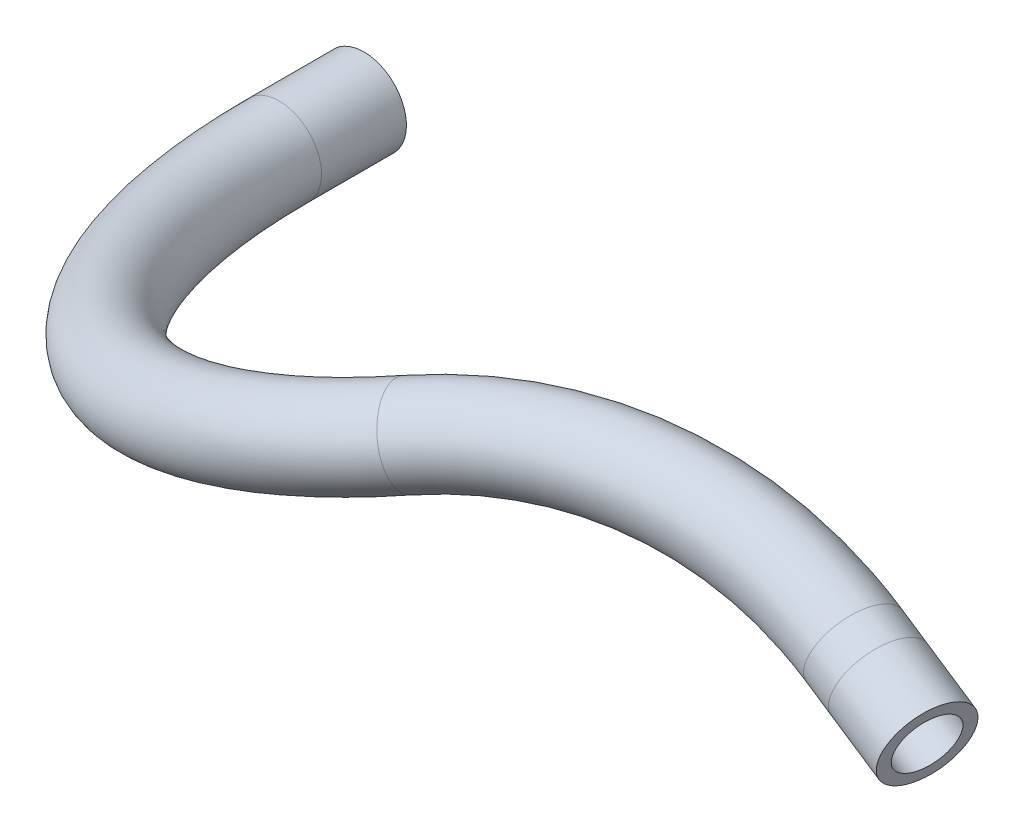
ISO-10303-21;
HEADER;
FILE_DESCRIPTION(('STEP AP214'),'2;1');
FILE_NAME('part.step','',(''),(''),'','','');
FILE_SCHEMA(('AUTOMOTIVE_DESIGN { 1 0 10303 214 1 1 1 1 }'));
ENDSEC;
DATA;
#1=APPLICATION_CONTEXT('core data for automotive mechanical design processes');
#2=APPLICATION_PROTOCOL_DEFINITION('international standard','automotive_design',2000,#1);
#3=PRODUCT_CONTEXT('',#1,'mechanical');
#4=PRODUCT('Part','Part','',(#3));
#5=PRODUCT_RELATED_PRODUCT_CATEGORY('part','',(#4));
#6=PRODUCT_DEFINITION_FORMATION('','',#4);
#7=PRODUCT_DEFINITION_CONTEXT('part definition',#1,'design');
#8=PRODUCT_DEFINITION('design','',#6,#7);
#9=PRODUCT_DEFINITION_SHAPE('','',#8);
#10=(LENGTH_UNIT() NAMED_UNIT(*) SI_UNIT(.MILLI.,.METRE.));
#11=(NAMED_UNIT(*) PLANE_ANGLE_UNIT() SI_UNIT($,.RADIAN.));
#12=(NAMED_UNIT(*) SI_UNIT($,.STERADIAN.) SOLID_ANGLE_UNIT());
#13=UNCERTAINTY_MEASURE_WITH_UNIT(LENGTH_MEASURE(1.E-05),#10,'distance_accuracy_value','');
#14=(GEOMETRIC_REPRESENTATION_CONTEXT(3) GLOBAL_UNCERTAINTY_ASSIGNED_CONTEXT((#13)) GLOBAL_UNIT_ASSIGNED_CONTEXT((#10,
#11,#12)) REPRESENTATION_CONTEXT('',''));
#15=CARTESIAN_POINT('',(0.,0.,0.));
#16=DIRECTION('',(0.,0.,1.));
#17=DIRECTION('',(1.,0.,0.));
#18=AXIS2_PLACEMENT_3D('',#15,#16,#17);
#19=CARTESIAN_POINT('',(23.4999999999999,73.,-26.9999999999999));
#20=DIRECTION('',(0.,0.,-1.));
#21=DIRECTION('',(0.414353258588674,-0.91011613385158,0.));
#22=AXIS2_PLACEMENT_3D('',#19,#20,#21);
#23=PLANE('',#22);
#24=CARTESIAN_POINT('',(23.4999999999999,73.,-26.9999999999999));
#25=DIRECTION('',(0.,0.,-1.));
#26=DIRECTION('',(-1.,0.,0.));
#27=AXIS2_PLACEMENT_3D('',#24,#25,#26);
#28=CIRCLE('',#27,9.525);
#29=CARTESIAN_POINT('',(13.9749999999999,73.,-26.9999999999999));
#30=VERTEX_POINT('',#29);
#31=EDGE_CURVE('E82',#30,#30,#28,.T.);
#32=ORIENTED_EDGE('',*,*,#31,.F.);
#33=EDGE_LOOP('',(#32));
#34=FACE_BOUND('',#33,.T.);
#35=CARTESIAN_POINT('',(23.4999999999999,73.,-26.9999999999999));
#36=DIRECTION('',(0.,0.,-1.));
#37=DIRECTION('',(0.414353258588674,-0.91011613385158,0.));
#38=AXIS2_PLACEMENT_3D('',#35,#36,#37);
#39=CIRCLE('',#38,13.49375);
#40=CARTESIAN_POINT('',(29.0911792830809,60.7191204188402,-26.9999999999999));
#41=VERTEX_POINT('',#40);
#42=EDGE_CURVE('E79',#41,#41,#39,.T.);
#43=ORIENTED_EDGE('',*,*,#42,.T.);
#44=EDGE_LOOP('',(#43));
#45=FACE_BOUND('',#44,.T.);
#46=ADVANCED_FACE('F57',(#34,#45),#23,.T.);
#47=CARTESIAN_POINT('',(342.615480311804,125.391529796908,112.95146684267));
#48=DIRECTION('',(-0.93105033936603,0.315857484412478,-0.182700068711052));
#49=DIRECTION('',(-0.32126478973692,-0.946989405893906,0.));
#50=AXIS2_PLACEMENT_3D('',#47,#48,#49);
#51=PLANE('',#50);
#52=CARTESIAN_POINT('',(342.615480311805,125.391529796908,112.951466842669));
#53=DIRECTION('',(-0.93105033936603,0.315857484412478,-0.182700068711052));
#54=DIRECTION('',(-0.32126478973692,-0.946989405893906,0.));
#55=AXIS2_PLACEMENT_3D('',#52,#53,#54);
#56=CIRCLE('',#55,9.525);
#57=CARTESIAN_POINT('',(339.55543318956,116.371455705768,112.951466842669));
#58=VERTEX_POINT('',#57);
#59=EDGE_CURVE('E85',#58,#58,#56,.T.);
#60=ORIENTED_EDGE('',*,*,#59,.T.);
#61=EDGE_LOOP('',(#60));
#62=FACE_BOUND('',#61,.T.);
#63=CARTESIAN_POINT('',(342.615480311804,125.391529796908,112.95146684267));
#64=DIRECTION('',(-0.93105033936603,0.315857484412478,-0.182700068711052));
#65=DIRECTION('',(-0.32126478973692,-0.946989405893906,0.));
#66=AXIS2_PLACEMENT_3D('',#63,#64,#65);
#67=CIRCLE('',#66,13.49375);
#68=CARTESIAN_POINT('',(338.280413555292,112.613091501127,112.95146684267));
#69=VERTEX_POINT('',#68);
#70=EDGE_CURVE('E11',#69,#69,#67,.T.);
#71=ORIENTED_EDGE('',*,*,#70,.F.);
#72=EDGE_LOOP('',(#71));
#73=FACE_BOUND('',#72,.T.);
#74=ADVANCED_FACE('F101',(#62,#73),#51,.F.);
#75=CARTESIAN_POINT('',(23.4999999999999,73.,-26.9999999999999));
#76=DIRECTION('',(0.,0.,1.));
#77=DIRECTION('',(1.,0.,0.));
#78=AXIS2_PLACEMENT_3D('',#75,#76,#77);
#79=CYLINDRICAL_SURFACE('',#78,13.49375);
#80=CARTESIAN_POINT('',(23.4999999999999,73.,1.11022302462516E-13));
#81=DIRECTION('',(0.,0.,-1.));
#82=DIRECTION('',(0.414353258588674,-0.91011613385158,0.));
#83=AXIS2_PLACEMENT_3D('',#80,#81,#82);
#84=CIRCLE('',#83,13.49375);
#85=CARTESIAN_POINT('',(10.8895858979336,68.1980477681548,1.28862380398844E-13));
#86=VERTEX_POINT('',#85);
#87=EDGE_CURVE('E76',#86,#86,#84,.T.);
#88=ORIENTED_EDGE('',*,*,#87,.T.);
#89=EDGE_LOOP('',(#88));
#90=FACE_BOUND('',#89,.T.);
#91=ORIENTED_EDGE('',*,*,#42,.F.);
#92=EDGE_LOOP('',(#91));
#93=FACE_BOUND('',#92,.T.);
#94=ADVANCED_FACE('F139',(#90,#93),#79,.T.);
#95=CARTESIAN_POINT('',(142.186250372384,118.194844535011,0.));
#96=DIRECTION('',(-0.355864917598515,0.934537404506958,0.));
#97=DIRECTION('',(-0.934537404506958,-0.355864917598515,0.));
#98=AXIS2_PLACEMENT_3D('',#95,#96,#97);
#99=TOROIDAL_SURFACE('',#98,127.000000000001,13.49375);
#100=CARTESIAN_POINT('',(183.3088317353,133.854018750594,119.133217722584));
#101=DIRECTION('',(-0.876649197488387,-0.333821517386558,0.346481426735551));
#102=DIRECTION('',(0.334637321694711,-0.940471371830551,-0.0594261028181365));
#103=AXIS2_PLACEMENT_3D('',#100,#101,#102);
#104=CIRCLE('',#103,13.49375);
#105=CARTESIAN_POINT('',(187.67810600511,135.517806010999,131.791122105608));
#106=VERTEX_POINT('',#105);
#107=EDGE_CURVE('E71',#106,#106,#104,.T.);
#108=CARTESIAN_POINT('',(142.186250372384,118.194844535011,0.));
#109=DIRECTION('',(-0.355864917598515,0.934537404506958,0.));
#110=DIRECTION('',(-0.934537404506958,-0.355864917598515,0.));
#111=AXIS2_PLACEMENT_3D('',#108,#109,#110);
#112=CIRCLE('',#111,140.493750000001);
#113=EDGE_CURVE('',#86,#106,#112,.T.);
#114=ORIENTED_EDGE('',*,*,#87,.F.);
#115=ORIENTED_EDGE('',*,*,#107,.T.);
#116=ORIENTED_EDGE('',*,*,#113,.T.);
#117=ORIENTED_EDGE('',*,*,#113,.F.);
#118=EDGE_LOOP('',(#114,#116,#115,#117));
#119=FACE_BOUND('',#118,.T.);
#120=ADVANCED_FACE('F141',(#119),#99,.T.);
#121=CARTESIAN_POINT('',(257.756919552151,24.8826788716506,202.50818728827));
#122=DIRECTION('',(-0.0635739395554372,-0.633456409006397,-0.771162325388191));
#123=DIRECTION('',(0.,0.772725447660314,-0.634740405629078));
#124=AXIS2_PLACEMENT_3D('',#121,#122,#123);
#125=TOROIDAL_SURFACE('',#124,156.104632361364,13.49375);
#126=CARTESIAN_POINT('',(313.846862770699,135.151241793518,107.306199149561));
#127=DIRECTION('',(-0.93105033936603,0.315857484412478,-0.182700068711052));
#128=DIRECTION('',(-0.32126478973692,-0.946989405893906,0.));
#129=AXIS2_PLACEMENT_3D('',#126,#127,#128);
#130=CIRCLE('',#129,13.49375);
#131=CARTESIAN_POINT('',(309.511796014187,122.372803497737,107.306199149561));
#132=VERTEX_POINT('',#131);
#133=EDGE_CURVE('E67',#132,#132,#130,.T.);
#134=ORIENTED_EDGE('',*,*,#133,.T.);
#135=EDGE_LOOP('',(#134));
#136=FACE_BOUND('',#135,.T.);
#137=ORIENTED_EDGE('',*,*,#107,.F.);
#138=EDGE_LOOP('',(#137));
#139=FACE_BOUND('',#138,.T.);
#140=ADVANCED_FACE('F148',(#136,#139),#125,.T.);
#141=CARTESIAN_POINT('',(313.846862770699,135.151241793518,107.306199149561));
#142=DIRECTION('',(0.931050339366029,-0.315857484412478,0.182700068711052));
#143=DIRECTION('',(0.32126478973692,0.946989405893906,0.));
#144=AXIS2_PLACEMENT_3D('',#141,#142,#143);
#145=CYLINDRICAL_SURFACE('',#144,13.49375);
#146=CARTESIAN_POINT('',(323.696537415887,131.80975388017,109.239001446462));
#147=DIRECTION('',(-0.93105033936603,0.315857484412478,-0.182700068711052));
#148=DIRECTION('',(-0.32126478973692,-0.946989405893906,0.));
#149=AXIS2_PLACEMENT_3D('',#146,#147,#148);
#150=CIRCLE('',#149,13.49375);
#151=CARTESIAN_POINT('',(319.361470659374,119.031315584389,109.239001446462));
#152=VERTEX_POINT('',#151);
#153=EDGE_CURVE('E63',#152,#152,#150,.T.);
#154=ORIENTED_EDGE('',*,*,#153,.T.);
#155=EDGE_LOOP('',(#154));
#156=FACE_BOUND('',#155,.T.);
#157=ORIENTED_EDGE('',*,*,#133,.F.);
#158=EDGE_LOOP('',(#157));
#159=FACE_BOUND('',#158,.T.);
#160=ADVANCED_FACE('F152',(#156,#159),#145,.T.);
#161=CARTESIAN_POINT('',(323.696537415887,131.80975388017,109.239001446462));
#162=DIRECTION('',(0.931050339366029,-0.315857484412477,0.182700068711052));
#163=DIRECTION('',(0.32126478973692,0.946989405893906,0.));
#164=AXIS2_PLACEMENT_3D('',#161,#162,#163);
#165=CYLINDRICAL_SURFACE('',#164,13.49375);
#166=ORIENTED_EDGE('',*,*,#70,.T.);
#167=EDGE_LOOP('',(#166));
#168=FACE_BOUND('',#167,.T.);
#169=ORIENTED_EDGE('',*,*,#153,.F.);
#170=EDGE_LOOP('',(#169));
#171=FACE_BOUND('',#170,.T.);
#172=ADVANCED_FACE('F131',(#168,#171),#165,.T.);
#173=CARTESIAN_POINT('',(23.4999999999999,73.,-32.));
#174=DIRECTION('',(0.,0.,1.));
#175=DIRECTION('',(1.,0.,0.));
#176=AXIS2_PLACEMENT_3D('',#173,#174,#175);
#177=CYLINDRICAL_SURFACE('',#176,9.525);
#178=CARTESIAN_POINT('',(23.4999999999996,72.9999999999999,-1.11022302462516E-13));
#179=DIRECTION('',(0.,0.,-1.));
#180=DIRECTION('',(0.414353258588674,-0.91011613385158,0.));
#181=AXIS2_PLACEMENT_3D('',#178,#179,#180);
#182=CIRCLE('',#181,9.525);
#183=CARTESIAN_POINT('',(14.5985312220706,69.610386659874,-1.15082651641544E-13));
#184=VERTEX_POINT('',#183);
#185=EDGE_CURVE('E86',#184,#184,#182,.T.);
#186=ORIENTED_EDGE('',*,*,#185,.F.);
#187=EDGE_LOOP('',(#186));
#188=FACE_BOUND('',#187,.T.);
#189=ORIENTED_EDGE('',*,*,#31,.T.);
#190=EDGE_LOOP('',(#189));
#191=FACE_BOUND('',#190,.T.);
#192=ADVANCED_FACE('F109',(#188,#191),#177,.F.);
#193=CARTESIAN_POINT('',(142.186250372384,118.194844535011,0.));
#194=DIRECTION('',(-0.355864917598515,0.934537404506958,0.));
#195=DIRECTION('',(-0.934537404506958,-0.355864917598515,0.));
#196=AXIS2_PLACEMENT_3D('',#193,#194,#195);
#197=TOROIDAL_SURFACE('',#196,127.000000000001,9.525);
#198=CARTESIAN_POINT('',(183.3088317353,133.854018750594,119.133217722584));
#199=DIRECTION('',(-0.876649197488388,-0.333821517386558,0.346481426735549));
#200=DIRECTION('',(0.33463732169471,-0.940471371830552,-0.059426102818136));
#201=AXIS2_PLACEMENT_3D('',#198,#199,#200);
#202=CIRCLE('',#201,9.525);
#203=CARTESIAN_POINT('',(186.393025337519,135.028456816762,128.068209051777));
#204=VERTEX_POINT('',#203);
#205=EDGE_CURVE('E89',#204,#204,#202,.T.);
#206=CARTESIAN_POINT('',(142.186250372384,118.194844535011,0.));
#207=DIRECTION('',(-0.355864917598515,0.934537404506958,0.));
#208=DIRECTION('',(-0.934537404506958,-0.355864917598515,0.));
#209=AXIS2_PLACEMENT_3D('',#206,#207,#208);
#210=CIRCLE('',#209,136.525000000001);
#211=EDGE_CURVE('',#184,#204,#210,.T.);
#212=ORIENTED_EDGE('',*,*,#185,.T.);
#213=ORIENTED_EDGE('',*,*,#205,.F.);
#214=ORIENTED_EDGE('',*,*,#211,.T.);
#215=ORIENTED_EDGE('',*,*,#211,.F.);
#216=EDGE_LOOP('',(#212,#214,#213,#215));
#217=FACE_BOUND('',#216,.T.);
#218=ADVANCED_FACE('F120',(#217),#197,.F.);
#219=CARTESIAN_POINT('',(257.756919552151,24.8826788716506,202.50818728827));
#220=DIRECTION('',(-0.0635739395554372,-0.633456409006397,-0.771162325388191));
#221=DIRECTION('',(0.,0.772725447660314,-0.634740405629078));
#222=AXIS2_PLACEMENT_3D('',#219,#220,#221);
#223=TOROIDAL_SURFACE('',#222,156.104632361364,9.525);
#224=CARTESIAN_POINT('',(313.846862770699,135.151241793518,107.30619914956));
#225=DIRECTION('',(-0.93105033936603,0.315857484412478,-0.182700068711052));
#226=DIRECTION('',(-0.32126478973692,-0.946989405893906,0.));
#227=AXIS2_PLACEMENT_3D('',#224,#225,#226);
#228=CIRCLE('',#227,9.525);
#229=CARTESIAN_POINT('',(310.786815648455,126.131167702379,107.30619914956));
#230=VERTEX_POINT('',#229);
#231=EDGE_CURVE('E92',#230,#230,#228,.T.);
#232=ORIENTED_EDGE('',*,*,#231,.F.);
#233=EDGE_LOOP('',(#232));
#234=FACE_BOUND('',#233,.T.);
#235=ORIENTED_EDGE('',*,*,#205,.T.);
#236=EDGE_LOOP('',(#235));
#237=FACE_BOUND('',#236,.T.);
#238=ADVANCED_FACE('F114',(#234,#237),#223,.F.);
#239=CARTESIAN_POINT('',(313.846862770699,135.151241793518,107.30619914956));
#240=DIRECTION('',(0.931050339366029,-0.315857484412478,0.182700068711052));
#241=DIRECTION('',(0.32126478973692,0.946989405893906,0.));
#242=AXIS2_PLACEMENT_3D('',#239,#240,#241);
#243=CYLINDRICAL_SURFACE('',#242,9.525);
#244=CARTESIAN_POINT('',(323.696537415887,131.80975388017,109.239001446461));
#245=DIRECTION('',(-0.93105033936603,0.315857484412478,-0.182700068711052));
#246=DIRECTION('',(-0.32126478973692,-0.946989405893906,0.));
#247=AXIS2_PLACEMENT_3D('',#244,#245,#246);
#248=CIRCLE('',#247,9.525);
#249=CARTESIAN_POINT('',(320.636490293642,122.789679789031,109.239001446461));
#250=VERTEX_POINT('',#249);
#251=EDGE_CURVE('E95',#250,#250,#248,.T.);
#252=ORIENTED_EDGE('',*,*,#251,.F.);
#253=EDGE_LOOP('',(#252));
#254=FACE_BOUND('',#253,.T.);
#255=ORIENTED_EDGE('',*,*,#231,.T.);
#256=EDGE_LOOP('',(#255));
#257=FACE_BOUND('',#256,.T.);
#258=ADVANCED_FACE('F107',(#254,#257),#243,.F.);
#259=CARTESIAN_POINT('',(323.696537415887,131.809753880169,109.239001446461));
#260=DIRECTION('',(0.931050339366029,-0.315857484412477,0.182700068711052));
#261=DIRECTION('',(0.32126478973692,0.946989405893906,0.));
#262=AXIS2_PLACEMENT_3D('',#259,#260,#261);
#263=CYLINDRICAL_SURFACE('',#262,9.525);
#264=ORIENTED_EDGE('',*,*,#59,.F.);
#265=EDGE_LOOP('',(#264));
#266=FACE_BOUND('',#265,.T.);
#267=ORIENTED_EDGE('',*,*,#251,.T.);
#268=EDGE_LOOP('',(#267));
#269=FACE_BOUND('',#268,.T.);
#270=ADVANCED_FACE('F104',(#266,#269),#263,.F.);
#271=CLOSED_SHELL('',(#46,#74,#94,#120,#140,#160,#172,#192,#218,#238,#258,#270));
#272=MANIFOLD_SOLID_BREP('B2',#271);
#273=ADVANCED_BREP_SHAPE_REPRESENTATION('',(#18,#272),#14);
#274=SHAPE_DEFINITION_REPRESENTATION(#9,#273);
ENDSEC;
END-ISO-10303-21;
